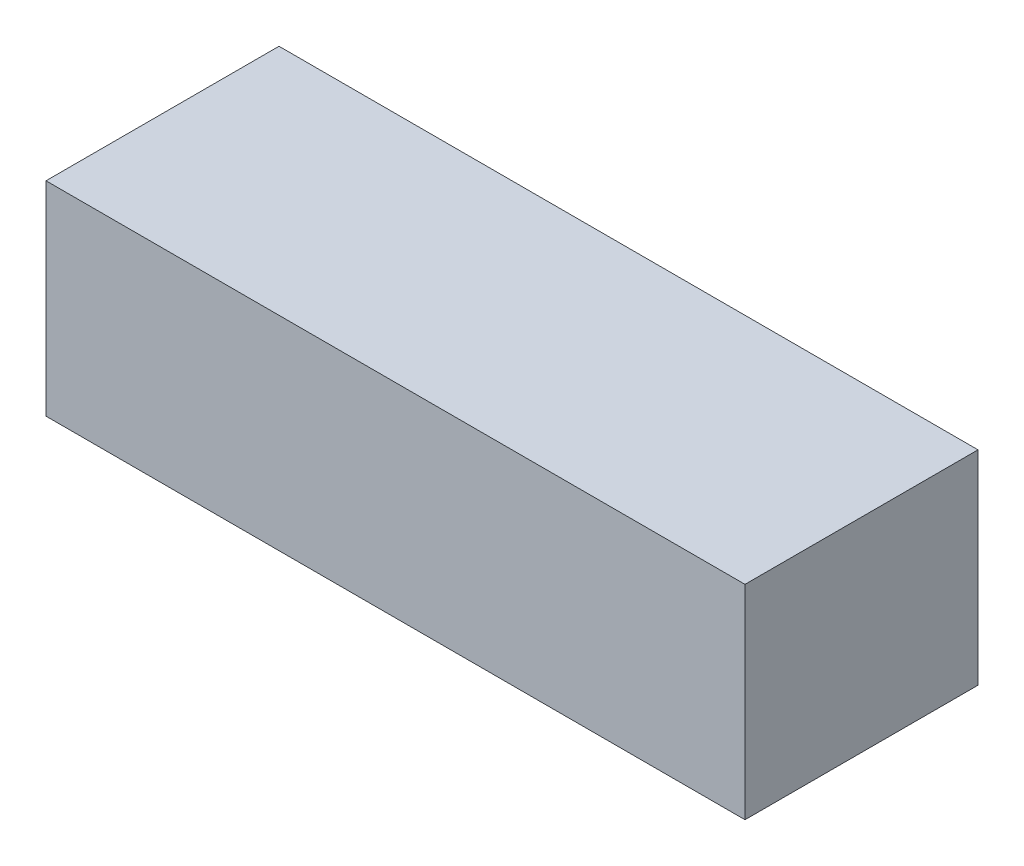
ISO-10303-21;
HEADER;
FILE_DESCRIPTION(('STEP AP214'),'2;1');
FILE_NAME('part.step','',(''),(''),'','','');
FILE_SCHEMA(('AUTOMOTIVE_DESIGN { 1 0 10303 214 1 1 1 1 }'));
ENDSEC;
DATA;
#1=APPLICATION_CONTEXT('core data for automotive mechanical design processes');
#2=APPLICATION_PROTOCOL_DEFINITION('international standard','automotive_design',2000,#1);
#3=PRODUCT_CONTEXT('',#1,'mechanical');
#4=PRODUCT('Part','Part','',(#3));
#5=PRODUCT_RELATED_PRODUCT_CATEGORY('part','',(#4));
#6=PRODUCT_DEFINITION_FORMATION('','',#4);
#7=PRODUCT_DEFINITION_CONTEXT('part definition',#1,'design');
#8=PRODUCT_DEFINITION('design','',#6,#7);
#9=PRODUCT_DEFINITION_SHAPE('','',#8);
#10=(LENGTH_UNIT() NAMED_UNIT(*) SI_UNIT(.MILLI.,.METRE.));
#11=(NAMED_UNIT(*) PLANE_ANGLE_UNIT() SI_UNIT($,.RADIAN.));
#12=(NAMED_UNIT(*) SI_UNIT($,.STERADIAN.) SOLID_ANGLE_UNIT());
#13=UNCERTAINTY_MEASURE_WITH_UNIT(LENGTH_MEASURE(1.E-05),#10,'distance_accuracy_value','');
#14=(GEOMETRIC_REPRESENTATION_CONTEXT(3) GLOBAL_UNCERTAINTY_ASSIGNED_CONTEXT((#13)) GLOBAL_UNIT_ASSIGNED_CONTEXT((#10,
#11,#12)) REPRESENTATION_CONTEXT('',''));
#15=CARTESIAN_POINT('',(0.,0.,0.));
#16=DIRECTION('',(0.,0.,1.));
#17=DIRECTION('',(1.,0.,0.));
#18=AXIS2_PLACEMENT_3D('',#15,#16,#17);
#19=CARTESIAN_POINT('',(0.,177.8,0.));
#20=DIRECTION('',(1.,0.,0.));
#21=DIRECTION('',(0.,0.,-1.));
#22=AXIS2_PLACEMENT_3D('',#19,#20,#21);
#23=PLANE('',#22);
#24=DIRECTION('',(0.,0.,1.));
#25=VECTOR('',#24,1.);
#26=CARTESIAN_POINT('',(0.,0.,0.));
#27=LINE('',#26,#25);
#28=CARTESIAN_POINT('',(0.,0.,-203.2));
#29=VERTEX_POINT('',#28);
#30=CARTESIAN_POINT('',(0.,0.,0.));
#31=VERTEX_POINT('',#30);
#32=EDGE_CURVE('E114',#29,#31,#27,.T.);
#33=ORIENTED_EDGE('',*,*,#32,.T.);
#34=DIRECTION('',(0.,-1.,0.));
#35=VECTOR('',#34,1.);
#36=CARTESIAN_POINT('',(0.,177.8,0.));
#37=LINE('',#36,#35);
#38=CARTESIAN_POINT('',(0.,177.8,0.));
#39=VERTEX_POINT('',#38);
#40=EDGE_CURVE('E11',#39,#31,#37,.T.);
#41=ORIENTED_EDGE('',*,*,#40,.F.);
#42=DIRECTION('',(0.,0.,1.));
#43=VECTOR('',#42,1.);
#44=CARTESIAN_POINT('',(0.,177.8,0.));
#45=LINE('',#44,#43);
#46=CARTESIAN_POINT('',(0.,177.8,-203.2));
#47=VERTEX_POINT('',#46);
#48=EDGE_CURVE('E98',#47,#39,#45,.T.);
#49=ORIENTED_EDGE('',*,*,#48,.F.);
#50=DIRECTION('',(0.,-1.,0.));
#51=VECTOR('',#50,1.);
#52=CARTESIAN_POINT('',(0.,177.8,-203.2));
#53=LINE('',#52,#51);
#54=EDGE_CURVE('E110',#47,#29,#53,.T.);
#55=ORIENTED_EDGE('',*,*,#54,.T.);
#56=EDGE_LOOP('',(#33,#41,#49,#55));
#57=FACE_BOUND('',#56,.T.);
#58=ADVANCED_FACE('F43',(#57),#23,.F.);
#59=CARTESIAN_POINT('',(0.,177.8,0.));
#60=DIRECTION('',(0.,0.,-1.));
#61=DIRECTION('',(-1.,0.,0.));
#62=AXIS2_PLACEMENT_3D('',#59,#60,#61);
#63=PLANE('',#62);
#64=DIRECTION('',(1.,0.,0.));
#65=VECTOR('',#64,1.);
#66=CARTESIAN_POINT('',(0.,0.,0.));
#67=LINE('',#66,#65);
#68=CARTESIAN_POINT('',(609.6,0.,0.));
#69=VERTEX_POINT('',#68);
#70=EDGE_CURVE('E103',#31,#69,#67,.T.);
#71=ORIENTED_EDGE('',*,*,#70,.T.);
#72=DIRECTION('',(0.,-1.,0.));
#73=VECTOR('',#72,1.);
#74=CARTESIAN_POINT('',(609.6,177.8,0.));
#75=LINE('',#74,#73);
#76=CARTESIAN_POINT('',(609.6,177.8,0.));
#77=VERTEX_POINT('',#76);
#78=EDGE_CURVE('E52',#77,#69,#75,.T.);
#79=ORIENTED_EDGE('',*,*,#78,.F.);
#80=DIRECTION('',(1.,0.,0.));
#81=VECTOR('',#80,1.);
#82=CARTESIAN_POINT('',(0.,177.8,0.));
#83=LINE('',#82,#81);
#84=EDGE_CURVE('E93',#39,#77,#83,.T.);
#85=ORIENTED_EDGE('',*,*,#84,.F.);
#86=ORIENTED_EDGE('',*,*,#40,.T.);
#87=EDGE_LOOP('',(#71,#79,#85,#86));
#88=FACE_BOUND('',#87,.T.);
#89=ADVANCED_FACE('F102',(#88),#63,.F.);
#90=CARTESIAN_POINT('',(609.6,177.8,0.));
#91=DIRECTION('',(-1.,0.,0.));
#92=DIRECTION('',(0.,0.,1.));
#93=AXIS2_PLACEMENT_3D('',#90,#91,#92);
#94=PLANE('',#93);
#95=DIRECTION('',(0.,0.,-1.));
#96=VECTOR('',#95,1.);
#97=CARTESIAN_POINT('',(609.6,0.,0.));
#98=LINE('',#97,#96);
#99=CARTESIAN_POINT('',(609.6,0.,-203.2));
#100=VERTEX_POINT('',#99);
#101=EDGE_CURVE('E79',#69,#100,#98,.T.);
#102=ORIENTED_EDGE('',*,*,#101,.T.);
#103=DIRECTION('',(0.,-1.,0.));
#104=VECTOR('',#103,1.);
#105=CARTESIAN_POINT('',(609.6,177.8,-203.2));
#106=LINE('',#105,#104);
#107=CARTESIAN_POINT('',(609.6,177.8,-203.2));
#108=VERTEX_POINT('',#107);
#109=EDGE_CURVE('E105',#108,#100,#106,.T.);
#110=ORIENTED_EDGE('',*,*,#109,.F.);
#111=DIRECTION('',(0.,0.,-1.));
#112=VECTOR('',#111,1.);
#113=CARTESIAN_POINT('',(609.6,177.8,0.));
#114=LINE('',#113,#112);
#115=EDGE_CURVE('E96',#77,#108,#114,.T.);
#116=ORIENTED_EDGE('',*,*,#115,.F.);
#117=ORIENTED_EDGE('',*,*,#78,.T.);
#118=EDGE_LOOP('',(#102,#110,#116,#117));
#119=FACE_BOUND('',#118,.T.);
#120=ADVANCED_FACE('F106',(#119),#94,.F.);
#121=CARTESIAN_POINT('',(0.,177.8,-203.2));
#122=DIRECTION('',(0.,0.,1.));
#123=DIRECTION('',(1.,0.,0.));
#124=AXIS2_PLACEMENT_3D('',#121,#122,#123);
#125=PLANE('',#124);
#126=DIRECTION('',(-1.,0.,0.));
#127=VECTOR('',#126,1.);
#128=CARTESIAN_POINT('',(0.,0.,-203.2));
#129=LINE('',#128,#127);
#130=EDGE_CURVE('E85',#100,#29,#129,.T.);
#131=ORIENTED_EDGE('',*,*,#130,.T.);
#132=ORIENTED_EDGE('',*,*,#54,.F.);
#133=DIRECTION('',(-1.,0.,0.));
#134=VECTOR('',#133,1.);
#135=CARTESIAN_POINT('',(0.,177.8,-203.2));
#136=LINE('',#135,#134);
#137=EDGE_CURVE('E62',#108,#47,#136,.T.);
#138=ORIENTED_EDGE('',*,*,#137,.F.);
#139=ORIENTED_EDGE('',*,*,#109,.T.);
#140=EDGE_LOOP('',(#131,#132,#138,#139));
#141=FACE_BOUND('',#140,.T.);
#142=ADVANCED_FACE('F124',(#141),#125,.F.);
#143=CARTESIAN_POINT('',(0.,177.8,0.));
#144=DIRECTION('',(0.,-1.,0.));
#145=DIRECTION('',(0.,0.,-1.));
#146=AXIS2_PLACEMENT_3D('',#143,#144,#145);
#147=PLANE('',#146);
#148=ORIENTED_EDGE('',*,*,#48,.T.);
#149=ORIENTED_EDGE('',*,*,#84,.T.);
#150=ORIENTED_EDGE('',*,*,#115,.T.);
#151=ORIENTED_EDGE('',*,*,#137,.T.);
#152=EDGE_LOOP('',(#148,#149,#150,#151));
#153=FACE_BOUND('',#152,.T.);
#154=ADVANCED_FACE('F94',(#153),#147,.F.);
#155=CARTESIAN_POINT('',(0.,0.,0.));
#156=DIRECTION('',(0.,-1.,0.));
#157=DIRECTION('',(0.,0.,-1.));
#158=AXIS2_PLACEMENT_3D('',#155,#156,#157);
#159=PLANE('',#158);
#160=ORIENTED_EDGE('',*,*,#32,.F.);
#161=ORIENTED_EDGE('',*,*,#130,.F.);
#162=ORIENTED_EDGE('',*,*,#101,.F.);
#163=ORIENTED_EDGE('',*,*,#70,.F.);
#164=EDGE_LOOP('',(#160,#161,#162,#163));
#165=FACE_BOUND('',#164,.T.);
#166=ADVANCED_FACE('F127',(#165),#159,.T.);
#167=CLOSED_SHELL('',(#58,#89,#120,#142,#154,#166));
#168=MANIFOLD_SOLID_BREP('B2',#167);
#169=ADVANCED_BREP_SHAPE_REPRESENTATION('',(#18,#168),#14);
#170=SHAPE_DEFINITION_REPRESENTATION(#9,#169);
ENDSEC;
END-ISO-10303-21;
